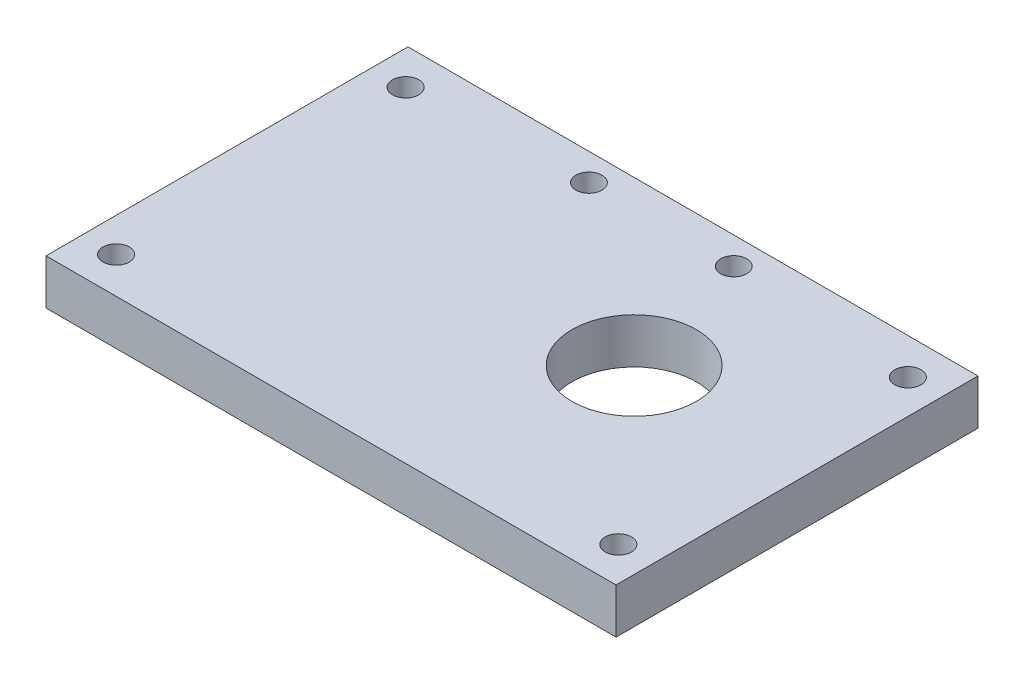
ISO-10303-21;
HEADER;
FILE_DESCRIPTION(('STEP AP214'),'2;1');
FILE_NAME('part.step','',(''),(''),'','','');
FILE_SCHEMA(('AUTOMOTIVE_DESIGN { 1 0 10303 214 1 1 1 1 }'));
ENDSEC;
DATA;
#1=APPLICATION_CONTEXT('core data for automotive mechanical design processes');
#2=APPLICATION_PROTOCOL_DEFINITION('international standard','automotive_design',2000,#1);
#3=PRODUCT_CONTEXT('',#1,'mechanical');
#4=PRODUCT('Part','Part','',(#3));
#5=PRODUCT_RELATED_PRODUCT_CATEGORY('part','',(#4));
#6=PRODUCT_DEFINITION_FORMATION('','',#4);
#7=PRODUCT_DEFINITION_CONTEXT('part definition',#1,'design');
#8=PRODUCT_DEFINITION('design','',#6,#7);
#9=PRODUCT_DEFINITION_SHAPE('','',#8);
#10=(LENGTH_UNIT() NAMED_UNIT(*) SI_UNIT(.MILLI.,.METRE.));
#11=(NAMED_UNIT(*) PLANE_ANGLE_UNIT() SI_UNIT($,.RADIAN.));
#12=(NAMED_UNIT(*) SI_UNIT($,.STERADIAN.) SOLID_ANGLE_UNIT());
#13=UNCERTAINTY_MEASURE_WITH_UNIT(LENGTH_MEASURE(1.E-05),#10,'distance_accuracy_value','');
#14=(GEOMETRIC_REPRESENTATION_CONTEXT(3) GLOBAL_UNCERTAINTY_ASSIGNED_CONTEXT((#13)) GLOBAL_UNIT_ASSIGNED_CONTEXT((#10,
#11,#12)) REPRESENTATION_CONTEXT('',''));
#15=CARTESIAN_POINT('',(0.,0.,0.));
#16=DIRECTION('',(0.,0.,1.));
#17=DIRECTION('',(1.,0.,0.));
#18=AXIS2_PLACEMENT_3D('',#15,#16,#17);
#19=CARTESIAN_POINT('',(40.005,6.35,-25.4));
#20=DIRECTION('',(-1.,0.,0.));
#21=DIRECTION('',(0.,0.,1.));
#22=AXIS2_PLACEMENT_3D('',#19,#20,#21);
#23=PLANE('',#22);
#24=DIRECTION('',(0.,0.,-1.));
#25=VECTOR('',#24,1.);
#26=CARTESIAN_POINT('',(40.005,0.,-25.4));
#27=LINE('',#26,#25);
#28=CARTESIAN_POINT('',(40.005,0.,25.4));
#29=VERTEX_POINT('',#28);
#30=CARTESIAN_POINT('',(40.005,0.,-25.4));
#31=VERTEX_POINT('',#30);
#32=EDGE_CURVE('E100',#29,#31,#27,.T.);
#33=ORIENTED_EDGE('',*,*,#32,.T.);
#34=DIRECTION('',(0.,-1.,0.));
#35=VECTOR('',#34,1.);
#36=CARTESIAN_POINT('',(40.005,6.35,-25.4));
#37=LINE('',#36,#35);
#38=CARTESIAN_POINT('',(40.005,6.35,-25.4));
#39=VERTEX_POINT('',#38);
#40=EDGE_CURVE('E11',#39,#31,#37,.T.);
#41=ORIENTED_EDGE('',*,*,#40,.F.);
#42=DIRECTION('',(0.,0.,-1.));
#43=VECTOR('',#42,1.);
#44=CARTESIAN_POINT('',(40.005,6.35,-25.4));
#45=LINE('',#44,#43);
#46=CARTESIAN_POINT('',(40.005,6.35,25.4));
#47=VERTEX_POINT('',#46);
#48=EDGE_CURVE('E88',#47,#39,#45,.T.);
#49=ORIENTED_EDGE('',*,*,#48,.F.);
#50=DIRECTION('',(0.,-1.,0.));
#51=VECTOR('',#50,1.);
#52=CARTESIAN_POINT('',(40.005,6.35,25.4));
#53=LINE('',#52,#51);
#54=EDGE_CURVE('E96',#47,#29,#53,.T.);
#55=ORIENTED_EDGE('',*,*,#54,.T.);
#56=EDGE_LOOP('',(#33,#41,#49,#55));
#57=FACE_BOUND('',#56,.T.);
#58=ADVANCED_FACE('F37',(#57),#23,.F.);
#59=CARTESIAN_POINT('',(-40.005,6.35,-25.4));
#60=DIRECTION('',(0.,0.,1.));
#61=DIRECTION('',(1.,0.,0.));
#62=AXIS2_PLACEMENT_3D('',#59,#60,#61);
#63=PLANE('',#62);
#64=DIRECTION('',(-1.,0.,0.));
#65=VECTOR('',#64,1.);
#66=CARTESIAN_POINT('',(-40.005,0.,-25.4));
#67=LINE('',#66,#65);
#68=CARTESIAN_POINT('',(-40.005,0.,-25.4));
#69=VERTEX_POINT('',#68);
#70=EDGE_CURVE('E92',#31,#69,#67,.T.);
#71=ORIENTED_EDGE('',*,*,#70,.T.);
#72=DIRECTION('',(0.,-1.,0.));
#73=VECTOR('',#72,1.);
#74=CARTESIAN_POINT('',(-40.005,6.35,-25.4));
#75=LINE('',#74,#73);
#76=CARTESIAN_POINT('',(-40.005,6.35,-25.4));
#77=VERTEX_POINT('',#76);
#78=EDGE_CURVE('E45',#77,#69,#75,.T.);
#79=ORIENTED_EDGE('',*,*,#78,.F.);
#80=DIRECTION('',(-1.,0.,0.));
#81=VECTOR('',#80,1.);
#82=CARTESIAN_POINT('',(-40.005,6.35,-25.4));
#83=LINE('',#82,#81);
#84=EDGE_CURVE('E83',#39,#77,#83,.T.);
#85=ORIENTED_EDGE('',*,*,#84,.F.);
#86=ORIENTED_EDGE('',*,*,#40,.T.);
#87=EDGE_LOOP('',(#71,#79,#85,#86));
#88=FACE_BOUND('',#87,.T.);
#89=ADVANCED_FACE('F91',(#88),#63,.F.);
#90=CARTESIAN_POINT('',(-40.005,6.35,-25.4));
#91=DIRECTION('',(1.,0.,0.));
#92=DIRECTION('',(0.,0.,-1.));
#93=AXIS2_PLACEMENT_3D('',#90,#91,#92);
#94=PLANE('',#93);
#95=DIRECTION('',(0.,0.,1.));
#96=VECTOR('',#95,1.);
#97=CARTESIAN_POINT('',(-40.005,0.,-25.4));
#98=LINE('',#97,#96);
#99=CARTESIAN_POINT('',(-40.005,0.,25.4));
#100=VERTEX_POINT('',#99);
#101=EDGE_CURVE('E70',#69,#100,#98,.T.);
#102=ORIENTED_EDGE('',*,*,#101,.T.);
#103=DIRECTION('',(0.,-1.,0.));
#104=VECTOR('',#103,1.);
#105=CARTESIAN_POINT('',(-40.005,6.35,25.4));
#106=LINE('',#105,#104);
#107=CARTESIAN_POINT('',(-40.005,6.35,25.4));
#108=VERTEX_POINT('',#107);
#109=EDGE_CURVE('E93',#108,#100,#106,.T.);
#110=ORIENTED_EDGE('',*,*,#109,.F.);
#111=DIRECTION('',(0.,0.,1.));
#112=VECTOR('',#111,1.);
#113=CARTESIAN_POINT('',(-40.005,6.35,-25.4));
#114=LINE('',#113,#112);
#115=EDGE_CURVE('E86',#77,#108,#114,.T.);
#116=ORIENTED_EDGE('',*,*,#115,.F.);
#117=ORIENTED_EDGE('',*,*,#78,.T.);
#118=EDGE_LOOP('',(#102,#110,#116,#117));
#119=FACE_BOUND('',#118,.T.);
#120=ADVANCED_FACE('F94',(#119),#94,.F.);
#121=CARTESIAN_POINT('',(-40.005,6.35,25.4));
#122=DIRECTION('',(0.,0.,-1.));
#123=DIRECTION('',(-1.,0.,0.));
#124=AXIS2_PLACEMENT_3D('',#121,#122,#123);
#125=PLANE('',#124);
#126=DIRECTION('',(1.,0.,0.));
#127=VECTOR('',#126,1.);
#128=CARTESIAN_POINT('',(-40.005,0.,25.4));
#129=LINE('',#128,#127);
#130=EDGE_CURVE('E76',#100,#29,#129,.T.);
#131=ORIENTED_EDGE('',*,*,#130,.T.);
#132=ORIENTED_EDGE('',*,*,#54,.F.);
#133=DIRECTION('',(1.,0.,0.));
#134=VECTOR('',#133,1.);
#135=CARTESIAN_POINT('',(-40.005,6.35,25.4));
#136=LINE('',#135,#134);
#137=EDGE_CURVE('E53',#108,#47,#136,.T.);
#138=ORIENTED_EDGE('',*,*,#137,.F.);
#139=ORIENTED_EDGE('',*,*,#109,.T.);
#140=EDGE_LOOP('',(#131,#132,#138,#139));
#141=FACE_BOUND('',#140,.T.);
#142=ADVANCED_FACE('F108',(#141),#125,.F.);
#143=CARTESIAN_POINT('',(0.,6.35,0.));
#144=DIRECTION('',(0.,1.,0.));
#145=DIRECTION('',(0.,0.,1.));
#146=AXIS2_PLACEMENT_3D('',#143,#144,#145);
#147=PLANE('',#146);
#148=CARTESIAN_POINT('',(14.605,6.35,-2.54));
#149=DIRECTION('',(0.,1.,0.));
#150=DIRECTION('',(0.,0.,1.));
#151=AXIS2_PLACEMENT_3D('',#148,#149,#150);
#152=CIRCLE('',#151,8.73125);
#153=CARTESIAN_POINT('',(14.605,6.35,6.19125));
#154=VERTEX_POINT('',#153);
#155=EDGE_CURVE('E150',#154,#154,#152,.T.);
#156=ORIENTED_EDGE('',*,*,#155,.F.);
#157=EDGE_LOOP('',(#156));
#158=FACE_BOUND('',#157,.T.);
#159=CARTESIAN_POINT('',(-10.795,6.35,-21.59));
#160=DIRECTION('',(0.,1.,0.));
#161=DIRECTION('',(0.,0.,1.));
#162=AXIS2_PLACEMENT_3D('',#159,#160,#161);
#163=CIRCLE('',#162,1.8288);
#164=CARTESIAN_POINT('',(-10.795,6.35,-19.7612));
#165=VERTEX_POINT('',#164);
#166=EDGE_CURVE('E147',#165,#165,#163,.T.);
#167=ORIENTED_EDGE('',*,*,#166,.F.);
#168=EDGE_LOOP('',(#167));
#169=FACE_BOUND('',#168,.T.);
#170=CARTESIAN_POINT('',(9.52499999999999,6.35,-21.59));
#171=DIRECTION('',(0.,1.,0.));
#172=DIRECTION('',(0.,0.,1.));
#173=AXIS2_PLACEMENT_3D('',#170,#171,#172);
#174=CIRCLE('',#173,1.8288);
#175=CARTESIAN_POINT('',(9.52499999999999,6.35,-19.7612));
#176=VERTEX_POINT('',#175);
#177=EDGE_CURVE('E141',#176,#176,#174,.T.);
#178=ORIENTED_EDGE('',*,*,#177,.F.);
#179=EDGE_LOOP('',(#178));
#180=FACE_BOUND('',#179,.T.);
#181=CARTESIAN_POINT('',(35.2425,6.35,-20.32));
#182=DIRECTION('',(0.,1.,0.));
#183=DIRECTION('',(0.,0.,1.));
#184=AXIS2_PLACEMENT_3D('',#181,#182,#183);
#185=CIRCLE('',#184,1.8415);
#186=CARTESIAN_POINT('',(35.2425,6.35,-18.4785));
#187=VERTEX_POINT('',#186);
#188=EDGE_CURVE('E123',#187,#187,#185,.T.);
#189=ORIENTED_EDGE('',*,*,#188,.F.);
#190=EDGE_LOOP('',(#189));
#191=FACE_BOUND('',#190,.T.);
#192=CARTESIAN_POINT('',(35.2425,6.35,20.32));
#193=DIRECTION('',(0.,1.,0.));
#194=DIRECTION('',(0.,0.,1.));
#195=AXIS2_PLACEMENT_3D('',#192,#193,#194);
#196=CIRCLE('',#195,1.8415);
#197=CARTESIAN_POINT('',(35.2425,6.35,22.1615));
#198=VERTEX_POINT('',#197);
#199=EDGE_CURVE('E130',#198,#198,#196,.T.);
#200=ORIENTED_EDGE('',*,*,#199,.F.);
#201=EDGE_LOOP('',(#200));
#202=FACE_BOUND('',#201,.T.);
#203=CARTESIAN_POINT('',(-35.2425,6.35,20.32));
#204=DIRECTION('',(0.,1.,0.));
#205=DIRECTION('',(0.,0.,1.));
#206=AXIS2_PLACEMENT_3D('',#203,#204,#205);
#207=CIRCLE('',#206,1.8415);
#208=CARTESIAN_POINT('',(-35.2425,6.35,22.1615));
#209=VERTEX_POINT('',#208);
#210=EDGE_CURVE('E117',#209,#209,#207,.T.);
#211=ORIENTED_EDGE('',*,*,#210,.F.);
#212=EDGE_LOOP('',(#211));
#213=FACE_BOUND('',#212,.T.);
#214=CARTESIAN_POINT('',(-35.2425,6.35,-20.32));
#215=DIRECTION('',(0.,1.,0.));
#216=DIRECTION('',(0.,0.,1.));
#217=AXIS2_PLACEMENT_3D('',#214,#215,#216);
#218=CIRCLE('',#217,1.8415);
#219=CARTESIAN_POINT('',(-35.2425,6.35,-18.4785));
#220=VERTEX_POINT('',#219);
#221=EDGE_CURVE('E114',#220,#220,#218,.T.);
#222=ORIENTED_EDGE('',*,*,#221,.F.);
#223=EDGE_LOOP('',(#222));
#224=FACE_BOUND('',#223,.T.);
#225=ORIENTED_EDGE('',*,*,#48,.T.);
#226=ORIENTED_EDGE('',*,*,#84,.T.);
#227=ORIENTED_EDGE('',*,*,#115,.T.);
#228=ORIENTED_EDGE('',*,*,#137,.T.);
#229=EDGE_LOOP('',(#225,#226,#227,#228));
#230=FACE_BOUND('',#229,.T.);
#231=ADVANCED_FACE('F84',(#158,#169,#180,#191,#202,#213,#224,#230),#147,.T.);
#232=CARTESIAN_POINT('',(0.,0.,0.));
#233=DIRECTION('',(0.,1.,0.));
#234=DIRECTION('',(0.,0.,1.));
#235=AXIS2_PLACEMENT_3D('',#232,#233,#234);
#236=PLANE('',#235);
#237=CARTESIAN_POINT('',(14.605,0.,-2.54));
#238=DIRECTION('',(0.,1.,0.));
#239=DIRECTION('',(0.,0.,1.));
#240=AXIS2_PLACEMENT_3D('',#237,#238,#239);
#241=CIRCLE('',#240,8.73125);
#242=CARTESIAN_POINT('',(14.605,0.,6.19125));
#243=VERTEX_POINT('',#242);
#244=EDGE_CURVE('E124',#243,#243,#241,.T.);
#245=ORIENTED_EDGE('',*,*,#244,.T.);
#246=EDGE_LOOP('',(#245));
#247=FACE_BOUND('',#246,.T.);
#248=CARTESIAN_POINT('',(-10.795,0.,-21.59));
#249=DIRECTION('',(0.,1.,0.));
#250=DIRECTION('',(0.,0.,1.));
#251=AXIS2_PLACEMENT_3D('',#248,#249,#250);
#252=CIRCLE('',#251,1.8288);
#253=CARTESIAN_POINT('',(-10.795,0.,-19.7612));
#254=VERTEX_POINT('',#253);
#255=EDGE_CURVE('E144',#254,#254,#252,.T.);
#256=ORIENTED_EDGE('',*,*,#255,.T.);
#257=EDGE_LOOP('',(#256));
#258=FACE_BOUND('',#257,.T.);
#259=CARTESIAN_POINT('',(9.52499999999999,0.,-21.59));
#260=DIRECTION('',(0.,1.,0.));
#261=DIRECTION('',(0.,0.,1.));
#262=AXIS2_PLACEMENT_3D('',#259,#260,#261);
#263=CIRCLE('',#262,1.8288);
#264=CARTESIAN_POINT('',(9.52499999999999,0.,-19.7612));
#265=VERTEX_POINT('',#264);
#266=EDGE_CURVE('E138',#265,#265,#263,.T.);
#267=ORIENTED_EDGE('',*,*,#266,.T.);
#268=EDGE_LOOP('',(#267));
#269=FACE_BOUND('',#268,.T.);
#270=CARTESIAN_POINT('',(35.2425,0.,-20.32));
#271=DIRECTION('',(0.,1.,0.));
#272=DIRECTION('',(0.,0.,1.));
#273=AXIS2_PLACEMENT_3D('',#270,#271,#272);
#274=CIRCLE('',#273,1.8415);
#275=CARTESIAN_POINT('',(35.2425,0.,-18.4785));
#276=VERTEX_POINT('',#275);
#277=EDGE_CURVE('E120',#276,#276,#274,.T.);
#278=ORIENTED_EDGE('',*,*,#277,.T.);
#279=EDGE_LOOP('',(#278));
#280=FACE_BOUND('',#279,.T.);
#281=CARTESIAN_POINT('',(35.2425,0.,20.32));
#282=DIRECTION('',(0.,1.,0.));
#283=DIRECTION('',(0.,0.,1.));
#284=AXIS2_PLACEMENT_3D('',#281,#282,#283);
#285=CIRCLE('',#284,1.8415);
#286=CARTESIAN_POINT('',(35.2425,0.,22.1615));
#287=VERTEX_POINT('',#286);
#288=EDGE_CURVE('E127',#287,#287,#285,.T.);
#289=ORIENTED_EDGE('',*,*,#288,.T.);
#290=EDGE_LOOP('',(#289));
#291=FACE_BOUND('',#290,.T.);
#292=CARTESIAN_POINT('',(-35.2425,0.,20.32));
#293=DIRECTION('',(0.,1.,0.));
#294=DIRECTION('',(0.,0.,1.));
#295=AXIS2_PLACEMENT_3D('',#292,#293,#294);
#296=CIRCLE('',#295,1.8415);
#297=CARTESIAN_POINT('',(-35.2425,0.,22.1615));
#298=VERTEX_POINT('',#297);
#299=EDGE_CURVE('E133',#298,#298,#296,.T.);
#300=ORIENTED_EDGE('',*,*,#299,.T.);
#301=EDGE_LOOP('',(#300));
#302=FACE_BOUND('',#301,.T.);
#303=CARTESIAN_POINT('',(-35.2425,0.,-20.32));
#304=DIRECTION('',(0.,1.,0.));
#305=DIRECTION('',(0.,0.,1.));
#306=AXIS2_PLACEMENT_3D('',#303,#304,#305);
#307=CIRCLE('',#306,1.8415);
#308=CARTESIAN_POINT('',(-35.2425,0.,-18.4785));
#309=VERTEX_POINT('',#308);
#310=EDGE_CURVE('E103',#309,#309,#307,.T.);
#311=ORIENTED_EDGE('',*,*,#310,.T.);
#312=EDGE_LOOP('',(#311));
#313=FACE_BOUND('',#312,.T.);
#314=ORIENTED_EDGE('',*,*,#32,.F.);
#315=ORIENTED_EDGE('',*,*,#130,.F.);
#316=ORIENTED_EDGE('',*,*,#101,.F.);
#317=ORIENTED_EDGE('',*,*,#70,.F.);
#318=EDGE_LOOP('',(#314,#315,#316,#317));
#319=FACE_BOUND('',#318,.T.);
#320=ADVANCED_FACE('F111',(#247,#258,#269,#280,#291,#302,#313,#319),#236,.F.);
#321=CARTESIAN_POINT('',(-35.2425,0.,-20.32));
#322=DIRECTION('',(0.,1.,0.));
#323=DIRECTION('',(0.,0.,1.));
#324=AXIS2_PLACEMENT_3D('',#321,#322,#323);
#325=CYLINDRICAL_SURFACE('',#324,1.8415);
#326=ORIENTED_EDGE('',*,*,#310,.F.);
#327=EDGE_LOOP('',(#326));
#328=FACE_BOUND('',#327,.T.);
#329=ORIENTED_EDGE('',*,*,#221,.T.);
#330=EDGE_LOOP('',(#329));
#331=FACE_BOUND('',#330,.T.);
#332=ADVANCED_FACE('F180',(#328,#331),#325,.F.);
#333=CARTESIAN_POINT('',(-35.2425,0.,20.32));
#334=DIRECTION('',(0.,1.,0.));
#335=DIRECTION('',(0.,0.,1.));
#336=AXIS2_PLACEMENT_3D('',#333,#334,#335);
#337=CYLINDRICAL_SURFACE('',#336,1.8415);
#338=ORIENTED_EDGE('',*,*,#299,.F.);
#339=EDGE_LOOP('',(#338));
#340=FACE_BOUND('',#339,.T.);
#341=ORIENTED_EDGE('',*,*,#210,.T.);
#342=EDGE_LOOP('',(#341));
#343=FACE_BOUND('',#342,.T.);
#344=ADVANCED_FACE('F182',(#340,#343),#337,.F.);
#345=CARTESIAN_POINT('',(35.2425,0.,20.32));
#346=DIRECTION('',(0.,1.,0.));
#347=DIRECTION('',(0.,0.,1.));
#348=AXIS2_PLACEMENT_3D('',#345,#346,#347);
#349=CYLINDRICAL_SURFACE('',#348,1.8415);
#350=ORIENTED_EDGE('',*,*,#288,.F.);
#351=EDGE_LOOP('',(#350));
#352=FACE_BOUND('',#351,.T.);
#353=ORIENTED_EDGE('',*,*,#199,.T.);
#354=EDGE_LOOP('',(#353));
#355=FACE_BOUND('',#354,.T.);
#356=ADVANCED_FACE('F189',(#352,#355),#349,.F.);
#357=CARTESIAN_POINT('',(35.2425,0.,-20.32));
#358=DIRECTION('',(0.,1.,0.));
#359=DIRECTION('',(0.,0.,1.));
#360=AXIS2_PLACEMENT_3D('',#357,#358,#359);
#361=CYLINDRICAL_SURFACE('',#360,1.8415);
#362=ORIENTED_EDGE('',*,*,#277,.F.);
#363=EDGE_LOOP('',(#362));
#364=FACE_BOUND('',#363,.T.);
#365=ORIENTED_EDGE('',*,*,#188,.T.);
#366=EDGE_LOOP('',(#365));
#367=FACE_BOUND('',#366,.T.);
#368=ADVANCED_FACE('F230',(#364,#367),#361,.F.);
#369=CARTESIAN_POINT('',(9.52499999999999,0.,-21.59));
#370=DIRECTION('',(0.,1.,0.));
#371=DIRECTION('',(0.,0.,1.));
#372=AXIS2_PLACEMENT_3D('',#369,#370,#371);
#373=CYLINDRICAL_SURFACE('',#372,1.8288);
#374=ORIENTED_EDGE('',*,*,#266,.F.);
#375=EDGE_LOOP('',(#374));
#376=FACE_BOUND('',#375,.T.);
#377=ORIENTED_EDGE('',*,*,#177,.T.);
#378=EDGE_LOOP('',(#377));
#379=FACE_BOUND('',#378,.T.);
#380=ADVANCED_FACE('F225',(#376,#379),#373,.F.);
#381=CARTESIAN_POINT('',(-10.795,0.,-21.59));
#382=DIRECTION('',(0.,1.,0.));
#383=DIRECTION('',(0.,0.,1.));
#384=AXIS2_PLACEMENT_3D('',#381,#382,#383);
#385=CYLINDRICAL_SURFACE('',#384,1.8288);
#386=ORIENTED_EDGE('',*,*,#255,.F.);
#387=EDGE_LOOP('',(#386));
#388=FACE_BOUND('',#387,.T.);
#389=ORIENTED_EDGE('',*,*,#166,.T.);
#390=EDGE_LOOP('',(#389));
#391=FACE_BOUND('',#390,.T.);
#392=ADVANCED_FACE('F161',(#388,#391),#385,.F.);
#393=CARTESIAN_POINT('',(14.605,0.,-2.54));
#394=DIRECTION('',(0.,1.,0.));
#395=DIRECTION('',(0.,0.,1.));
#396=AXIS2_PLACEMENT_3D('',#393,#394,#395);
#397=CYLINDRICAL_SURFACE('',#396,8.73125);
#398=ORIENTED_EDGE('',*,*,#244,.F.);
#399=EDGE_LOOP('',(#398));
#400=FACE_BOUND('',#399,.T.);
#401=ORIENTED_EDGE('',*,*,#155,.T.);
#402=EDGE_LOOP('',(#401));
#403=FACE_BOUND('',#402,.T.);
#404=ADVANCED_FACE('F158',(#400,#403),#397,.F.);
#405=CLOSED_SHELL('',(#58,#89,#120,#142,#231,#320,#332,#344,#356,#368,#380,#392,#404));
#406=MANIFOLD_SOLID_BREP('B2',#405);
#407=ADVANCED_BREP_SHAPE_REPRESENTATION('',(#18,#406),#14);
#408=SHAPE_DEFINITION_REPRESENTATION(#9,#407);
ENDSEC;
END-ISO-10303-21;
